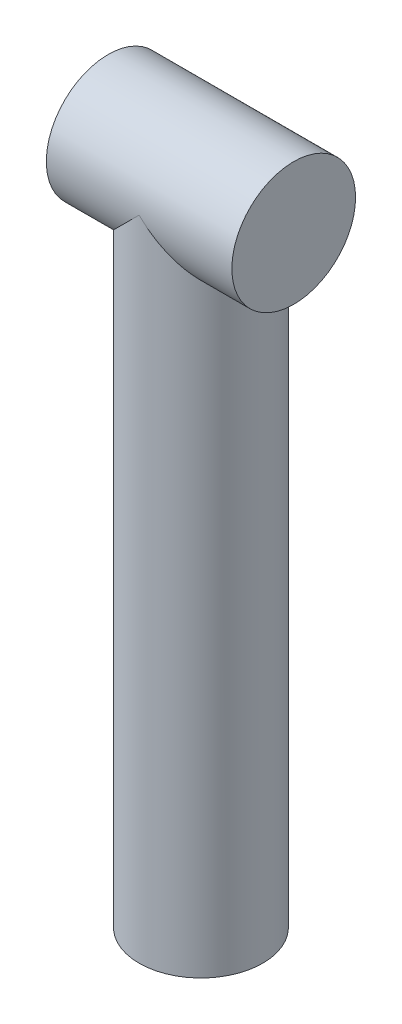
ISO-10303-21;
HEADER;
FILE_DESCRIPTION(('STEP AP214'),'2;1');
FILE_NAME('part.step','',(''),(''),'','','');
FILE_SCHEMA(('AUTOMOTIVE_DESIGN { 1 0 10303 214 1 1 1 1 }'));
ENDSEC;
DATA;
#1=APPLICATION_CONTEXT('core data for automotive mechanical design processes');
#2=APPLICATION_PROTOCOL_DEFINITION('international standard','automotive_design',2000,#1);
#3=PRODUCT_CONTEXT('',#1,'mechanical');
#4=PRODUCT('Part','Part','',(#3));
#5=PRODUCT_RELATED_PRODUCT_CATEGORY('part','',(#4));
#6=PRODUCT_DEFINITION_FORMATION('','',#4);
#7=PRODUCT_DEFINITION_CONTEXT('part definition',#1,'design');
#8=PRODUCT_DEFINITION('design','',#6,#7);
#9=PRODUCT_DEFINITION_SHAPE('','',#8);
#10=(LENGTH_UNIT() NAMED_UNIT(*) SI_UNIT(.MILLI.,.METRE.));
#11=(NAMED_UNIT(*) PLANE_ANGLE_UNIT() SI_UNIT($,.RADIAN.));
#12=(NAMED_UNIT(*) SI_UNIT($,.STERADIAN.) SOLID_ANGLE_UNIT());
#13=UNCERTAINTY_MEASURE_WITH_UNIT(LENGTH_MEASURE(1.E-05),#10,'distance_accuracy_value','');
#14=(GEOMETRIC_REPRESENTATION_CONTEXT(3) GLOBAL_UNCERTAINTY_ASSIGNED_CONTEXT((#13)) GLOBAL_UNIT_ASSIGNED_CONTEXT((#10,
#11,#12)) REPRESENTATION_CONTEXT('',''));
#15=CARTESIAN_POINT('',(0.,0.,0.));
#16=DIRECTION('',(0.,0.,1.));
#17=DIRECTION('',(1.,0.,0.));
#18=AXIS2_PLACEMENT_3D('',#15,#16,#17);
#19=CARTESIAN_POINT('',(0.,209.5,0.));
#20=DIRECTION('',(0.,-1.,0.));
#21=DIRECTION('',(0.,0.,-1.));
#22=AXIS2_PLACEMENT_3D('',#19,#20,#21);
#23=CYLINDRICAL_SURFACE('',#22,20.);
#24=CARTESIAN_POINT('',(0.,0.,0.));
#25=DIRECTION('',(0.,1.,0.));
#26=DIRECTION('',(0.,0.,1.));
#27=AXIS2_PLACEMENT_3D('',#24,#25,#26);
#28=CIRCLE('',#27,20.);
#29=CARTESIAN_POINT('',(0.,0.,20.));
#30=VERTEX_POINT('',#29);
#31=EDGE_CURVE('E11',#30,#30,#28,.T.);
#32=ORIENTED_EDGE('',*,*,#31,.T.);
#33=EDGE_LOOP('',(#32));
#34=FACE_BOUND('',#33,.T.);
#35=CARTESIAN_POINT('',(0.,209.5,0.));
#36=DIRECTION('',(-0.707106781186547,-0.707106781186547,0.));
#37=DIRECTION('',(0.707106781186547,-0.707106781186547,0.));
#38=AXIS2_PLACEMENT_3D('',#35,#36,#37);
#39=ELLIPSE('',#38,28.2842712474619,20.);
#40=CARTESIAN_POINT('',(0.,209.5,20.));
#41=VERTEX_POINT('',#40);
#42=CARTESIAN_POINT('',(0.,209.5,-20.));
#43=VERTEX_POINT('',#42);
#44=EDGE_CURVE('E47',#41,#43,#39,.F.);
#45=ORIENTED_EDGE('',*,*,#44,.F.);
#46=CARTESIAN_POINT('',(0.,209.5,0.));
#47=DIRECTION('',(0.707106781186547,-0.707106781186547,0.));
#48=DIRECTION('',(-0.707106781186547,-0.707106781186547,0.));
#49=AXIS2_PLACEMENT_3D('',#46,#47,#48);
#50=ELLIPSE('',#49,28.2842712474619,20.);
#51=EDGE_CURVE('E53',#43,#41,#50,.F.);
#52=ORIENTED_EDGE('',*,*,#51,.F.);
#53=EDGE_LOOP('',(#45,#52));
#54=FACE_BOUND('',#53,.T.);
#55=ADVANCED_FACE('F39',(#34,#54),#23,.T.);
#56=CARTESIAN_POINT('',(0.,0.,0.));
#57=DIRECTION('',(0.,1.,0.));
#58=DIRECTION('',(0.,0.,1.));
#59=AXIS2_PLACEMENT_3D('',#56,#57,#58);
#60=PLANE('',#59);
#61=ORIENTED_EDGE('',*,*,#31,.F.);
#62=EDGE_LOOP('',(#61));
#63=FACE_BOUND('',#62,.T.);
#64=ADVANCED_FACE('F82',(#63),#60,.F.);
#65=CARTESIAN_POINT('',(30.,209.5,0.));
#66=DIRECTION('',(-1.,0.,0.));
#67=DIRECTION('',(0.,0.,1.));
#68=AXIS2_PLACEMENT_3D('',#65,#66,#67);
#69=CYLINDRICAL_SURFACE('',#68,20.);
#70=CARTESIAN_POINT('',(30.,209.5,0.));
#71=DIRECTION('',(1.,0.,0.));
#72=DIRECTION('',(0.,0.,-1.));
#73=AXIS2_PLACEMENT_3D('',#70,#71,#72);
#74=CIRCLE('',#73,20.);
#75=CARTESIAN_POINT('',(30.,209.5,-20.));
#76=VERTEX_POINT('',#75);
#77=EDGE_CURVE('E59',#76,#76,#74,.T.);
#78=ORIENTED_EDGE('',*,*,#77,.F.);
#79=EDGE_LOOP('',(#78));
#80=FACE_BOUND('',#79,.T.);
#81=CARTESIAN_POINT('',(-30.,209.5,0.));
#82=DIRECTION('',(1.,0.,0.));
#83=DIRECTION('',(0.,0.,-1.));
#84=AXIS2_PLACEMENT_3D('',#81,#82,#83);
#85=CIRCLE('',#84,20.);
#86=CARTESIAN_POINT('',(-30.,209.5,-20.));
#87=VERTEX_POINT('',#86);
#88=EDGE_CURVE('E63',#87,#87,#85,.T.);
#89=ORIENTED_EDGE('',*,*,#88,.T.);
#90=EDGE_LOOP('',(#89));
#91=FACE_BOUND('',#90,.T.);
#92=ORIENTED_EDGE('',*,*,#51,.T.);
#93=ORIENTED_EDGE('',*,*,#44,.T.);
#94=EDGE_LOOP('',(#92,#93));
#95=FACE_BOUND('',#94,.T.);
#96=ADVANCED_FACE('F57',(#80,#91,#95),#69,.T.);
#97=CARTESIAN_POINT('',(30.,209.5,0.));
#98=DIRECTION('',(1.,0.,0.));
#99=DIRECTION('',(0.,0.,-1.));
#100=AXIS2_PLACEMENT_3D('',#97,#98,#99);
#101=PLANE('',#100);
#102=ORIENTED_EDGE('',*,*,#77,.T.);
#103=EDGE_LOOP('',(#102));
#104=FACE_BOUND('',#103,.T.);
#105=ADVANCED_FACE('F73',(#104),#101,.T.);
#106=CARTESIAN_POINT('',(-30.,209.5,0.));
#107=DIRECTION('',(1.,0.,0.));
#108=DIRECTION('',(0.,0.,-1.));
#109=AXIS2_PLACEMENT_3D('',#106,#107,#108);
#110=PLANE('',#109);
#111=ORIENTED_EDGE('',*,*,#88,.F.);
#112=EDGE_LOOP('',(#111));
#113=FACE_BOUND('',#112,.T.);
#114=ADVANCED_FACE('F71',(#113),#110,.F.);
#115=CLOSED_SHELL('',(#55,#64,#96,#105,#114));
#116=MANIFOLD_SOLID_BREP('B2',#115);
#117=ADVANCED_BREP_SHAPE_REPRESENTATION('',(#18,#116),#14);
#118=SHAPE_DEFINITION_REPRESENTATION(#9,#117);
ENDSEC;
END-ISO-10303-21;
